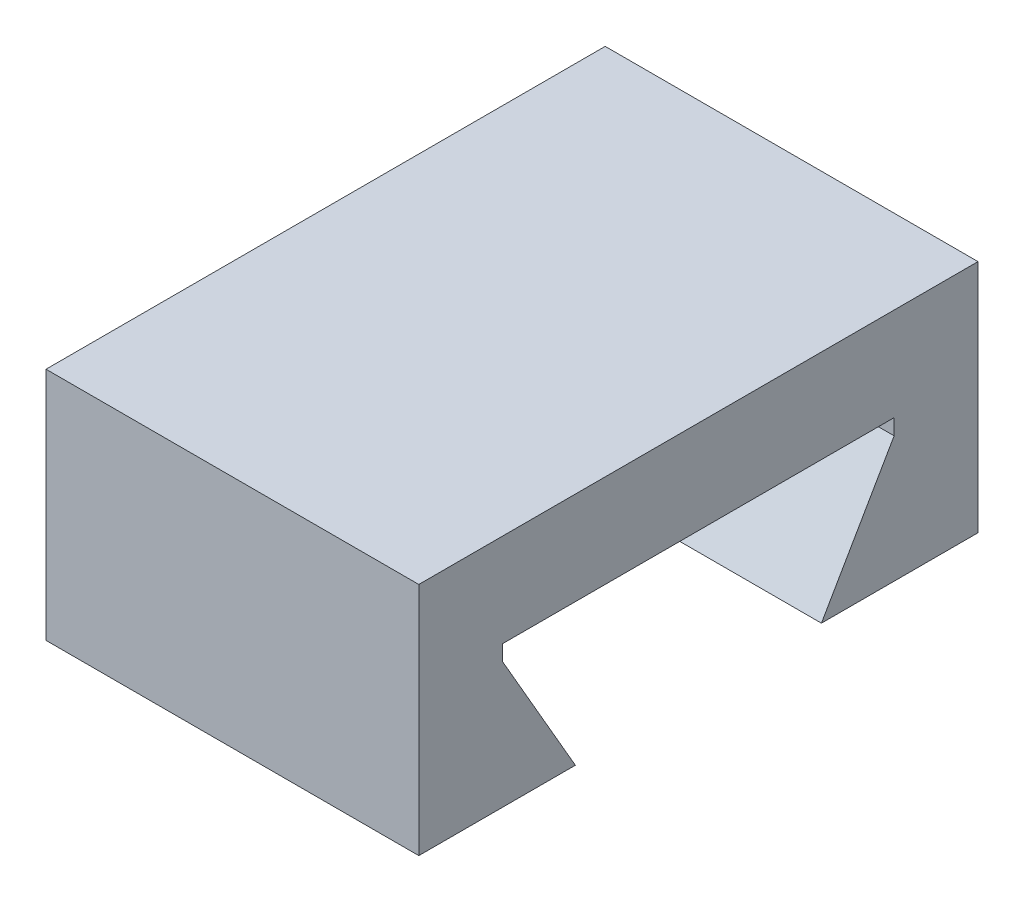
ISO-10303-21;
HEADER;
FILE_DESCRIPTION(('STEP AP214'),'2;1');
FILE_NAME('part.step','',(''),(''),'','','');
FILE_SCHEMA(('AUTOMOTIVE_DESIGN { 1 0 10303 214 1 1 1 1 }'));
ENDSEC;
DATA;
#1=APPLICATION_CONTEXT('core data for automotive mechanical design processes');
#2=APPLICATION_PROTOCOL_DEFINITION('international standard','automotive_design',2000,#1);
#3=PRODUCT_CONTEXT('',#1,'mechanical');
#4=PRODUCT('Part','Part','',(#3));
#5=PRODUCT_RELATED_PRODUCT_CATEGORY('part','',(#4));
#6=PRODUCT_DEFINITION_FORMATION('','',#4);
#7=PRODUCT_DEFINITION_CONTEXT('part definition',#1,'design');
#8=PRODUCT_DEFINITION('design','',#6,#7);
#9=PRODUCT_DEFINITION_SHAPE('','',#8);
#10=(LENGTH_UNIT() NAMED_UNIT(*) SI_UNIT(.MILLI.,.METRE.));
#11=(NAMED_UNIT(*) PLANE_ANGLE_UNIT() SI_UNIT($,.RADIAN.));
#12=(NAMED_UNIT(*) SI_UNIT($,.STERADIAN.) SOLID_ANGLE_UNIT());
#13=UNCERTAINTY_MEASURE_WITH_UNIT(LENGTH_MEASURE(1.E-05),#10,'distance_accuracy_value','');
#14=(GEOMETRIC_REPRESENTATION_CONTEXT(3) GLOBAL_UNCERTAINTY_ASSIGNED_CONTEXT((#13)) GLOBAL_UNIT_ASSIGNED_CONTEXT((#10,
#11,#12)) REPRESENTATION_CONTEXT('',''));
#15=CARTESIAN_POINT('',(0.,0.,0.));
#16=DIRECTION('',(0.,0.,1.));
#17=DIRECTION('',(1.,0.,0.));
#18=AXIS2_PLACEMENT_3D('',#15,#16,#17);
#19=CARTESIAN_POINT('',(25.4,0.,-38.1));
#20=DIRECTION('',(0.,-1.,0.));
#21=DIRECTION('',(0.,0.,-1.));
#22=AXIS2_PLACEMENT_3D('',#19,#20,#21);
#23=PLANE('',#22);
#24=DIRECTION('',(0.,0.,1.));
#25=VECTOR('',#24,1.);
#26=CARTESIAN_POINT('',(0.,0.,-38.1));
#27=LINE('',#26,#25);
#28=CARTESIAN_POINT('',(0.,0.,-38.1));
#29=VERTEX_POINT('',#28);
#30=CARTESIAN_POINT('',(0.,0.,0.));
#31=VERTEX_POINT('',#30);
#32=EDGE_CURVE('E144',#29,#31,#27,.T.);
#33=ORIENTED_EDGE('',*,*,#32,.T.);
#34=DIRECTION('',(-1.,0.,0.));
#35=VECTOR('',#34,1.);
#36=CARTESIAN_POINT('',(25.4,0.,0.));
#37=LINE('',#36,#35);
#38=CARTESIAN_POINT('',(25.4,0.,0.));
#39=VERTEX_POINT('',#38);
#40=EDGE_CURVE('E11',#39,#31,#37,.T.);
#41=ORIENTED_EDGE('',*,*,#40,.F.);
#42=DIRECTION('',(0.,0.,1.));
#43=VECTOR('',#42,1.);
#44=CARTESIAN_POINT('',(25.4,0.,-38.1));
#45=LINE('',#44,#43);
#46=CARTESIAN_POINT('',(25.4,0.,-38.1));
#47=VERTEX_POINT('',#46);
#48=EDGE_CURVE('E162',#47,#39,#45,.T.);
#49=ORIENTED_EDGE('',*,*,#48,.F.);
#50=DIRECTION('',(-1.,0.,0.));
#51=VECTOR('',#50,1.);
#52=CARTESIAN_POINT('',(25.4,0.,-38.1));
#53=LINE('',#52,#51);
#54=EDGE_CURVE('E140',#47,#29,#53,.T.);
#55=ORIENTED_EDGE('',*,*,#54,.T.);
#56=EDGE_LOOP('',(#33,#41,#49,#55));
#57=FACE_BOUND('',#56,.T.);
#58=ADVANCED_FACE('F36',(#57),#23,.F.);
#59=CARTESIAN_POINT('',(25.4,0.,0.));
#60=DIRECTION('',(0.,0.,-1.));
#61=DIRECTION('',(-1.,0.,0.));
#62=AXIS2_PLACEMENT_3D('',#59,#60,#61);
#63=PLANE('',#62);
#64=DIRECTION('',(0.,-1.,0.));
#65=VECTOR('',#64,1.);
#66=CARTESIAN_POINT('',(0.,0.,0.));
#67=LINE('',#66,#65);
#68=CARTESIAN_POINT('',(0.,-16.002,0.));
#69=VERTEX_POINT('',#68);
#70=EDGE_CURVE('E147',#31,#69,#67,.T.);
#71=ORIENTED_EDGE('',*,*,#70,.T.);
#72=DIRECTION('',(-1.,0.,0.));
#73=VECTOR('',#72,1.);
#74=CARTESIAN_POINT('',(25.4,-16.002,0.));
#75=LINE('',#74,#73);
#76=CARTESIAN_POINT('',(25.4,-16.002,0.));
#77=VERTEX_POINT('',#76);
#78=EDGE_CURVE('E44',#77,#69,#75,.T.);
#79=ORIENTED_EDGE('',*,*,#78,.F.);
#80=DIRECTION('',(0.,-1.,0.));
#81=VECTOR('',#80,1.);
#82=CARTESIAN_POINT('',(25.4,0.,0.));
#83=LINE('',#82,#81);
#84=EDGE_CURVE('E101',#39,#77,#83,.T.);
#85=ORIENTED_EDGE('',*,*,#84,.F.);
#86=ORIENTED_EDGE('',*,*,#40,.T.);
#87=EDGE_LOOP('',(#71,#79,#85,#86));
#88=FACE_BOUND('',#87,.T.);
#89=ADVANCED_FACE('F211',(#88),#63,.F.);
#90=CARTESIAN_POINT('',(25.4,-16.002,0.));
#91=DIRECTION('',(0.,1.,0.));
#92=DIRECTION('',(0.,0.,1.));
#93=AXIS2_PLACEMENT_3D('',#90,#91,#92);
#94=PLANE('',#93);
#95=DIRECTION('',(0.,0.,-1.));
#96=VECTOR('',#95,1.);
#97=CARTESIAN_POINT('',(0.,-16.002,0.));
#98=LINE('',#97,#96);
#99=CARTESIAN_POINT('',(0.,-16.002,-10.668));
#100=VERTEX_POINT('',#99);
#101=EDGE_CURVE('E149',#69,#100,#98,.T.);
#102=ORIENTED_EDGE('',*,*,#101,.T.);
#103=DIRECTION('',(-1.,0.,0.));
#104=VECTOR('',#103,1.);
#105=CARTESIAN_POINT('',(25.4,-16.002,-10.668));
#106=LINE('',#105,#104);
#107=CARTESIAN_POINT('',(25.4,-16.002,-10.668));
#108=VERTEX_POINT('',#107);
#109=EDGE_CURVE('E175',#108,#100,#106,.T.);
#110=ORIENTED_EDGE('',*,*,#109,.F.);
#111=DIRECTION('',(0.,0.,-1.));
#112=VECTOR('',#111,1.);
#113=CARTESIAN_POINT('',(25.4,-16.002,0.));
#114=LINE('',#113,#112);
#115=EDGE_CURVE('E183',#77,#108,#114,.T.);
#116=ORIENTED_EDGE('',*,*,#115,.F.);
#117=ORIENTED_EDGE('',*,*,#78,.T.);
#118=EDGE_LOOP('',(#102,#110,#116,#117));
#119=FACE_BOUND('',#118,.T.);
#120=ADVANCED_FACE('F181',(#119),#94,.F.);
#121=CARTESIAN_POINT('',(25.4,-16.002,-10.668));
#122=DIRECTION('',(0.,-0.500000000000003,0.866025403784436));
#123=DIRECTION('',(0.,-0.866025403784437,-0.500000000000004));
#124=AXIS2_PLACEMENT_3D('',#121,#122,#123);
#125=PLANE('',#124);
#126=DIRECTION('',(0.,0.866025403784437,0.500000000000003));
#127=VECTOR('',#126,1.);
#128=CARTESIAN_POINT('',(0.,-16.002,-10.668));
#129=LINE('',#128,#127);
#130=CARTESIAN_POINT('',(0.,-7.42315235011143,-5.715));
#131=VERTEX_POINT('',#130);
#132=EDGE_CURVE('E151',#100,#131,#129,.T.);
#133=ORIENTED_EDGE('',*,*,#132,.T.);
#134=DIRECTION('',(-1.,0.,0.));
#135=VECTOR('',#134,1.);
#136=CARTESIAN_POINT('',(25.4,-7.42315235011143,-5.715));
#137=LINE('',#136,#135);
#138=CARTESIAN_POINT('',(25.4,-7.42315235011143,-5.715));
#139=VERTEX_POINT('',#138);
#140=EDGE_CURVE('E172',#139,#131,#137,.T.);
#141=ORIENTED_EDGE('',*,*,#140,.F.);
#142=DIRECTION('',(0.,0.866025403784437,0.500000000000003));
#143=VECTOR('',#142,1.);
#144=CARTESIAN_POINT('',(25.4,-16.002,-10.668));
#145=LINE('',#144,#143);
#146=EDGE_CURVE('E201',#108,#139,#145,.T.);
#147=ORIENTED_EDGE('',*,*,#146,.F.);
#148=ORIENTED_EDGE('',*,*,#109,.T.);
#149=EDGE_LOOP('',(#133,#141,#147,#148));
#150=FACE_BOUND('',#149,.T.);
#151=ADVANCED_FACE('F192',(#150),#125,.F.);
#152=CARTESIAN_POINT('',(25.4,-7.42315235011143,-5.715));
#153=DIRECTION('',(0.,0.,1.));
#154=DIRECTION('',(1.,0.,0.));
#155=AXIS2_PLACEMENT_3D('',#152,#153,#154);
#156=PLANE('',#155);
#157=DIRECTION('',(0.,1.,0.));
#158=VECTOR('',#157,1.);
#159=CARTESIAN_POINT('',(0.,-7.42315235011143,-5.715));
#160=LINE('',#159,#158);
#161=CARTESIAN_POINT('',(0.,-6.35,-5.715));
#162=VERTEX_POINT('',#161);
#163=EDGE_CURVE('E153',#131,#162,#160,.T.);
#164=ORIENTED_EDGE('',*,*,#163,.T.);
#165=DIRECTION('',(-1.,0.,0.));
#166=VECTOR('',#165,1.);
#167=CARTESIAN_POINT('',(25.4,-6.35,-5.715));
#168=LINE('',#167,#166);
#169=CARTESIAN_POINT('',(25.4,-6.35,-5.715));
#170=VERTEX_POINT('',#169);
#171=EDGE_CURVE('E169',#170,#162,#168,.T.);
#172=ORIENTED_EDGE('',*,*,#171,.F.);
#173=DIRECTION('',(0.,1.,0.));
#174=VECTOR('',#173,1.);
#175=CARTESIAN_POINT('',(25.4,-7.42315235011143,-5.715));
#176=LINE('',#175,#174);
#177=EDGE_CURVE('E198',#139,#170,#176,.T.);
#178=ORIENTED_EDGE('',*,*,#177,.F.);
#179=ORIENTED_EDGE('',*,*,#140,.T.);
#180=EDGE_LOOP('',(#164,#172,#178,#179));
#181=FACE_BOUND('',#180,.T.);
#182=ADVANCED_FACE('F196',(#181),#156,.F.);
#183=CARTESIAN_POINT('',(25.4,-6.35,-5.715));
#184=DIRECTION('',(0.,1.,0.));
#185=DIRECTION('',(0.,0.,1.));
#186=AXIS2_PLACEMENT_3D('',#183,#184,#185);
#187=PLANE('',#186);
#188=DIRECTION('',(0.,0.,-1.));
#189=VECTOR('',#188,1.);
#190=CARTESIAN_POINT('',(0.,-6.35,-5.715));
#191=LINE('',#190,#189);
#192=CARTESIAN_POINT('',(0.,-6.35,-32.385));
#193=VERTEX_POINT('',#192);
#194=EDGE_CURVE('E155',#162,#193,#191,.T.);
#195=ORIENTED_EDGE('',*,*,#194,.T.);
#196=DIRECTION('',(-1.,0.,0.));
#197=VECTOR('',#196,1.);
#198=CARTESIAN_POINT('',(25.4,-6.35,-32.385));
#199=LINE('',#198,#197);
#200=CARTESIAN_POINT('',(25.4,-6.35,-32.385));
#201=VERTEX_POINT('',#200);
#202=EDGE_CURVE('E166',#201,#193,#199,.T.);
#203=ORIENTED_EDGE('',*,*,#202,.F.);
#204=DIRECTION('',(0.,0.,-1.));
#205=VECTOR('',#204,1.);
#206=CARTESIAN_POINT('',(25.4,-6.35,-5.715));
#207=LINE('',#206,#205);
#208=EDGE_CURVE('E200',#170,#201,#207,.T.);
#209=ORIENTED_EDGE('',*,*,#208,.F.);
#210=ORIENTED_EDGE('',*,*,#171,.T.);
#211=EDGE_LOOP('',(#195,#203,#209,#210));
#212=FACE_BOUND('',#211,.T.);
#213=ADVANCED_FACE('F223',(#212),#187,.F.);
#214=CARTESIAN_POINT('',(25.4,-6.35,-32.385));
#215=DIRECTION('',(0.,0.,-1.));
#216=DIRECTION('',(-1.,0.,0.));
#217=AXIS2_PLACEMENT_3D('',#214,#215,#216);
#218=PLANE('',#217);
#219=DIRECTION('',(0.,-1.,0.));
#220=VECTOR('',#219,1.);
#221=CARTESIAN_POINT('',(0.,-6.35,-32.385));
#222=LINE('',#221,#220);
#223=CARTESIAN_POINT('',(0.,-7.42315235011143,-32.385));
#224=VERTEX_POINT('',#223);
#225=EDGE_CURVE('E157',#193,#224,#222,.T.);
#226=ORIENTED_EDGE('',*,*,#225,.T.);
#227=DIRECTION('',(-1.,0.,0.));
#228=VECTOR('',#227,1.);
#229=CARTESIAN_POINT('',(25.4,-7.42315235011143,-32.385));
#230=LINE('',#229,#228);
#231=CARTESIAN_POINT('',(25.4,-7.42315235011143,-32.385));
#232=VERTEX_POINT('',#231);
#233=EDGE_CURVE('E135',#232,#224,#230,.T.);
#234=ORIENTED_EDGE('',*,*,#233,.F.);
#235=DIRECTION('',(0.,-1.,0.));
#236=VECTOR('',#235,1.);
#237=CARTESIAN_POINT('',(25.4,-6.35,-32.385));
#238=LINE('',#237,#236);
#239=EDGE_CURVE('E126',#201,#232,#238,.T.);
#240=ORIENTED_EDGE('',*,*,#239,.F.);
#241=ORIENTED_EDGE('',*,*,#202,.T.);
#242=EDGE_LOOP('',(#226,#234,#240,#241));
#243=FACE_BOUND('',#242,.T.);
#244=ADVANCED_FACE('F226',(#243),#218,.F.);
#245=CARTESIAN_POINT('',(25.4,-7.42315235011143,-32.385));
#246=DIRECTION('',(0.,-0.500000000000003,-0.866025403784437));
#247=DIRECTION('',(0.,0.866025403784437,-0.500000000000003));
#248=AXIS2_PLACEMENT_3D('',#245,#246,#247);
#249=PLANE('',#248);
#250=DIRECTION('',(0.,-0.866025403784437,0.500000000000003));
#251=VECTOR('',#250,1.);
#252=CARTESIAN_POINT('',(0.,-7.42315235011143,-32.385));
#253=LINE('',#252,#251);
#254=CARTESIAN_POINT('',(0.,-16.002,-27.432));
#255=VERTEX_POINT('',#254);
#256=EDGE_CURVE('E134',#224,#255,#253,.T.);
#257=ORIENTED_EDGE('',*,*,#256,.T.);
#258=DIRECTION('',(-1.,0.,0.));
#259=VECTOR('',#258,1.);
#260=CARTESIAN_POINT('',(25.4,-16.002,-27.432));
#261=LINE('',#260,#259);
#262=CARTESIAN_POINT('',(25.4,-16.002,-27.432));
#263=VERTEX_POINT('',#262);
#264=EDGE_CURVE('E131',#263,#255,#261,.T.);
#265=ORIENTED_EDGE('',*,*,#264,.F.);
#266=DIRECTION('',(0.,-0.866025403784437,0.500000000000003));
#267=VECTOR('',#266,1.);
#268=CARTESIAN_POINT('',(25.4,-7.42315235011143,-32.385));
#269=LINE('',#268,#267);
#270=EDGE_CURVE('E120',#232,#263,#269,.T.);
#271=ORIENTED_EDGE('',*,*,#270,.F.);
#272=ORIENTED_EDGE('',*,*,#233,.T.);
#273=EDGE_LOOP('',(#257,#265,#271,#272));
#274=FACE_BOUND('',#273,.T.);
#275=ADVANCED_FACE('F132',(#274),#249,.F.);
#276=CARTESIAN_POINT('',(25.4,-16.002,-27.432));
#277=DIRECTION('',(0.,1.,0.));
#278=DIRECTION('',(0.,0.,1.));
#279=AXIS2_PLACEMENT_3D('',#276,#277,#278);
#280=PLANE('',#279);
#281=DIRECTION('',(0.,0.,-1.));
#282=VECTOR('',#281,1.);
#283=CARTESIAN_POINT('',(0.,-16.002,-27.432));
#284=LINE('',#283,#282);
#285=CARTESIAN_POINT('',(0.,-16.002,-38.1));
#286=VERTEX_POINT('',#285);
#287=EDGE_CURVE('E87',#255,#286,#284,.T.);
#288=ORIENTED_EDGE('',*,*,#287,.T.);
#289=DIRECTION('',(-1.,0.,0.));
#290=VECTOR('',#289,1.);
#291=CARTESIAN_POINT('',(25.4,-16.002,-38.1));
#292=LINE('',#291,#290);
#293=CARTESIAN_POINT('',(25.4,-16.002,-38.1));
#294=VERTEX_POINT('',#293);
#295=EDGE_CURVE('E136',#294,#286,#292,.T.);
#296=ORIENTED_EDGE('',*,*,#295,.F.);
#297=DIRECTION('',(0.,0.,-1.));
#298=VECTOR('',#297,1.);
#299=CARTESIAN_POINT('',(25.4,-16.002,-27.432));
#300=LINE('',#299,#298);
#301=EDGE_CURVE('E124',#263,#294,#300,.T.);
#302=ORIENTED_EDGE('',*,*,#301,.F.);
#303=ORIENTED_EDGE('',*,*,#264,.T.);
#304=EDGE_LOOP('',(#288,#296,#302,#303));
#305=FACE_BOUND('',#304,.T.);
#306=ADVANCED_FACE('F138',(#305),#280,.F.);
#307=CARTESIAN_POINT('',(25.4,-16.002,-38.1));
#308=DIRECTION('',(0.,0.,1.));
#309=DIRECTION('',(1.,0.,0.));
#310=AXIS2_PLACEMENT_3D('',#307,#308,#309);
#311=PLANE('',#310);
#312=DIRECTION('',(0.,1.,0.));
#313=VECTOR('',#312,1.);
#314=CARTESIAN_POINT('',(0.,-16.002,-38.1));
#315=LINE('',#314,#313);
#316=EDGE_CURVE('E93',#286,#29,#315,.T.);
#317=ORIENTED_EDGE('',*,*,#316,.T.);
#318=ORIENTED_EDGE('',*,*,#54,.F.);
#319=DIRECTION('',(0.,1.,0.));
#320=VECTOR('',#319,1.);
#321=CARTESIAN_POINT('',(25.4,-16.002,-38.1));
#322=LINE('',#321,#320);
#323=EDGE_CURVE('E52',#294,#47,#322,.T.);
#324=ORIENTED_EDGE('',*,*,#323,.F.);
#325=ORIENTED_EDGE('',*,*,#295,.T.);
#326=EDGE_LOOP('',(#317,#318,#324,#325));
#327=FACE_BOUND('',#326,.T.);
#328=ADVANCED_FACE('F235',(#327),#311,.F.);
#329=CARTESIAN_POINT('',(25.4,0.,0.));
#330=DIRECTION('',(1.,0.,0.));
#331=DIRECTION('',(0.,0.,-1.));
#332=AXIS2_PLACEMENT_3D('',#329,#330,#331);
#333=PLANE('',#332);
#334=ORIENTED_EDGE('',*,*,#48,.T.);
#335=ORIENTED_EDGE('',*,*,#84,.T.);
#336=ORIENTED_EDGE('',*,*,#115,.T.);
#337=ORIENTED_EDGE('',*,*,#146,.T.);
#338=ORIENTED_EDGE('',*,*,#177,.T.);
#339=ORIENTED_EDGE('',*,*,#208,.T.);
#340=ORIENTED_EDGE('',*,*,#239,.T.);
#341=ORIENTED_EDGE('',*,*,#270,.T.);
#342=ORIENTED_EDGE('',*,*,#301,.T.);
#343=ORIENTED_EDGE('',*,*,#323,.T.);
#344=EDGE_LOOP('',(#334,#335,#336,#337,#338,#339,#340,#341,#342,#343));
#345=FACE_BOUND('',#344,.T.);
#346=ADVANCED_FACE('F122',(#345),#333,.T.);
#347=CARTESIAN_POINT('',(0.,0.,0.));
#348=DIRECTION('',(1.,0.,0.));
#349=DIRECTION('',(0.,0.,-1.));
#350=AXIS2_PLACEMENT_3D('',#347,#348,#349);
#351=PLANE('',#350);
#352=ORIENTED_EDGE('',*,*,#32,.F.);
#353=ORIENTED_EDGE('',*,*,#316,.F.);
#354=ORIENTED_EDGE('',*,*,#287,.F.);
#355=ORIENTED_EDGE('',*,*,#256,.F.);
#356=ORIENTED_EDGE('',*,*,#225,.F.);
#357=ORIENTED_EDGE('',*,*,#194,.F.);
#358=ORIENTED_EDGE('',*,*,#163,.F.);
#359=ORIENTED_EDGE('',*,*,#132,.F.);
#360=ORIENTED_EDGE('',*,*,#101,.F.);
#361=ORIENTED_EDGE('',*,*,#70,.F.);
#362=EDGE_LOOP('',(#352,#353,#354,#355,#356,#357,#358,#359,#360,#361));
#363=FACE_BOUND('',#362,.T.);
#364=ADVANCED_FACE('F187',(#363),#351,.F.);
#365=CLOSED_SHELL('',(#58,#89,#120,#151,#182,#213,#244,#275,#306,#328,#346,#364));
#366=MANIFOLD_SOLID_BREP('B2',#365);
#367=ADVANCED_BREP_SHAPE_REPRESENTATION('',(#18,#366),#14);
#368=SHAPE_DEFINITION_REPRESENTATION(#9,#367);
ENDSEC;
END-ISO-10303-21;
